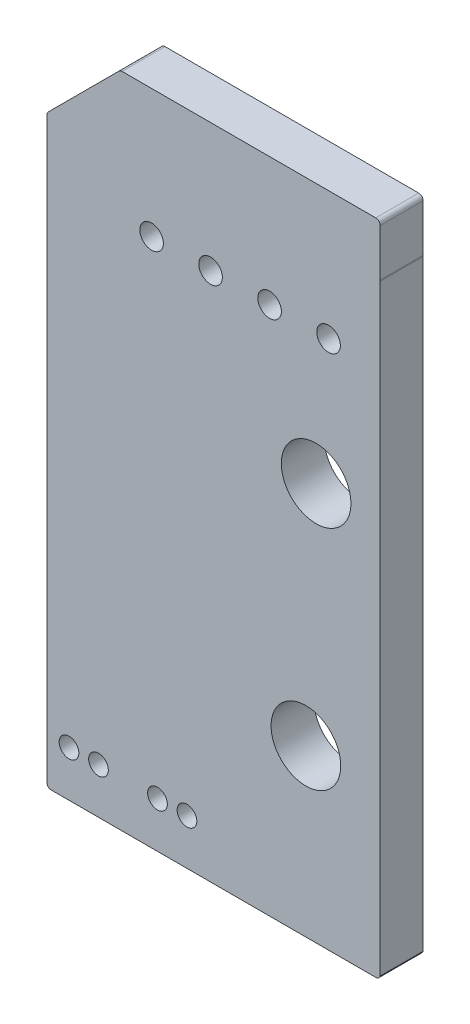
ISO-10303-21;
HEADER;
FILE_DESCRIPTION(('STEP AP214'),'2;1');
FILE_NAME('part.step','',(''),(''),'','','');
FILE_SCHEMA(('AUTOMOTIVE_DESIGN { 1 0 10303 214 1 1 1 1 }'));
ENDSEC;
DATA;
#1=APPLICATION_CONTEXT('core data for automotive mechanical design processes');
#2=APPLICATION_PROTOCOL_DEFINITION('international standard','automotive_design',2000,#1);
#3=PRODUCT_CONTEXT('',#1,'mechanical');
#4=PRODUCT('Part','Part','',(#3));
#5=PRODUCT_RELATED_PRODUCT_CATEGORY('part','',(#4));
#6=PRODUCT_DEFINITION_FORMATION('','',#4);
#7=PRODUCT_DEFINITION_CONTEXT('part definition',#1,'design');
#8=PRODUCT_DEFINITION('design','',#6,#7);
#9=PRODUCT_DEFINITION_SHAPE('','',#8);
#10=(LENGTH_UNIT() NAMED_UNIT(*) SI_UNIT(.MILLI.,.METRE.));
#11=(NAMED_UNIT(*) PLANE_ANGLE_UNIT() SI_UNIT($,.RADIAN.));
#12=(NAMED_UNIT(*) SI_UNIT($,.STERADIAN.) SOLID_ANGLE_UNIT());
#13=UNCERTAINTY_MEASURE_WITH_UNIT(LENGTH_MEASURE(1.E-05),#10,'distance_accuracy_value','');
#14=(GEOMETRIC_REPRESENTATION_CONTEXT(3) GLOBAL_UNCERTAINTY_ASSIGNED_CONTEXT((#13)) GLOBAL_UNIT_ASSIGNED_CONTEXT((#10,
#11,#12)) REPRESENTATION_CONTEXT('',''));
#15=CARTESIAN_POINT('',(0.,0.,0.));
#16=DIRECTION('',(0.,0.,1.));
#17=DIRECTION('',(1.,0.,0.));
#18=AXIS2_PLACEMENT_3D('',#15,#16,#17);
#19=CARTESIAN_POINT('',(7.16790000000064,0.,1.85));
#20=DIRECTION('',(-1.,0.,0.));
#21=DIRECTION('',(0.,0.,1.));
#22=AXIS2_PLACEMENT_3D('',#19,#20,#21);
#23=PLANE('',#22);
#24=DIRECTION('',(0.,1.,0.));
#25=VECTOR('',#24,1.);
#26=CARTESIAN_POINT('',(7.16790000000064,0.,0.));
#27=LINE('',#26,#25);
#28=CARTESIAN_POINT('',(7.16790000000064,-13.994089221172,0.));
#29=VERTEX_POINT('',#28);
#30=CARTESIAN_POINT('',(7.16790000000064,11.9139286193169,0.));
#31=VERTEX_POINT('',#30);
#32=EDGE_CURVE('E186',#29,#31,#27,.T.);
#33=ORIENTED_EDGE('',*,*,#32,.T.);
#34=DIRECTION('',(0.,0.,-1.));
#35=VECTOR('',#34,1.);
#36=CARTESIAN_POINT('',(7.16790000000064,11.9139286193169,1.85));
#37=LINE('',#36,#35);
#38=CARTESIAN_POINT('',(7.16790000000064,11.9139286193169,1.85));
#39=VERTEX_POINT('',#38);
#40=EDGE_CURVE('E11',#39,#31,#37,.T.);
#41=ORIENTED_EDGE('',*,*,#40,.F.);
#42=DIRECTION('',(0.,1.,0.));
#43=VECTOR('',#42,1.);
#44=CARTESIAN_POINT('',(7.16790000000064,0.,1.85));
#45=LINE('',#44,#43);
#46=CARTESIAN_POINT('',(7.16790000000064,-13.994089221172,1.85));
#47=VERTEX_POINT('',#46);
#48=EDGE_CURVE('E270',#47,#39,#45,.T.);
#49=ORIENTED_EDGE('',*,*,#48,.F.);
#50=DIRECTION('',(0.,0.,-1.));
#51=VECTOR('',#50,1.);
#52=CARTESIAN_POINT('',(7.16790000000064,-13.994089221172,1.85));
#53=LINE('',#52,#51);
#54=EDGE_CURVE('E152',#47,#29,#53,.T.);
#55=ORIENTED_EDGE('',*,*,#54,.T.);
#56=EDGE_LOOP('',(#33,#41,#49,#55));
#57=FACE_BOUND('',#56,.T.);
#58=ADVANCED_FACE('F36',(#57),#23,.F.);
#59=CARTESIAN_POINT('',(6.98500000000043,11.9672000000003,1.85));
#60=DIRECTION('',(0.,0.,-1.));
#61=DIRECTION('',(-1.,0.,0.));
#62=AXIS2_PLACEMENT_3D('',#59,#60,#61);
#63=CYLINDRICAL_SURFACE('',#62,0.190499999999983);
#64=CARTESIAN_POINT('',(6.98500000000043,11.9672000000003,0.));
#65=DIRECTION('',(0.,0.,1.));
#66=DIRECTION('',(1.,0.,0.));
#67=AXIS2_PLACEMENT_3D('',#64,#65,#66);
#68=CIRCLE('',#67,0.190499999999983);
#69=CARTESIAN_POINT('',(7.17550000000041,11.9672000000003,0.));
#70=VERTEX_POINT('',#69);
#71=EDGE_CURVE('E189',#31,#70,#68,.T.);
#72=ORIENTED_EDGE('',*,*,#71,.T.);
#73=DIRECTION('',(0.,0.,-1.));
#74=VECTOR('',#73,1.);
#75=CARTESIAN_POINT('',(7.17550000000041,11.9672000000003,1.85));
#76=LINE('',#75,#74);
#77=CARTESIAN_POINT('',(7.17550000000041,11.9672000000003,1.85));
#78=VERTEX_POINT('',#77);
#79=EDGE_CURVE('E45',#78,#70,#76,.T.);
#80=ORIENTED_EDGE('',*,*,#79,.F.);
#81=CARTESIAN_POINT('',(6.98500000000043,11.9672000000003,1.85));
#82=DIRECTION('',(0.,0.,1.));
#83=DIRECTION('',(1.,0.,0.));
#84=AXIS2_PLACEMENT_3D('',#81,#82,#83);
#85=CIRCLE('',#84,0.190499999999983);
#86=EDGE_CURVE('E108',#39,#78,#85,.T.);
#87=ORIENTED_EDGE('',*,*,#86,.F.);
#88=ORIENTED_EDGE('',*,*,#40,.T.);
#89=EDGE_LOOP('',(#72,#80,#87,#88));
#90=FACE_BOUND('',#89,.T.);
#91=ADVANCED_FACE('F285',(#90),#63,.T.);
#92=CARTESIAN_POINT('',(7.17550000000041,0.,1.85));
#93=DIRECTION('',(-1.,0.,0.));
#94=DIRECTION('',(0.,0.,1.));
#95=AXIS2_PLACEMENT_3D('',#92,#93,#94);
#96=PLANE('',#95);
#97=DIRECTION('',(0.,1.,0.));
#98=VECTOR('',#97,1.);
#99=CARTESIAN_POINT('',(7.17550000000041,0.,0.));
#100=LINE('',#99,#98);
#101=CARTESIAN_POINT('',(7.17550000000041,13.9992000000003,0.));
#102=VERTEX_POINT('',#101);
#103=EDGE_CURVE('E191',#70,#102,#100,.T.);
#104=ORIENTED_EDGE('',*,*,#103,.T.);
#105=DIRECTION('',(0.,0.,-1.));
#106=VECTOR('',#105,1.);
#107=CARTESIAN_POINT('',(7.17550000000041,13.9992000000003,1.85));
#108=LINE('',#107,#106);
#109=CARTESIAN_POINT('',(7.17550000000041,13.9992000000003,1.85));
#110=VERTEX_POINT('',#109);
#111=EDGE_CURVE('E228',#110,#102,#108,.T.);
#112=ORIENTED_EDGE('',*,*,#111,.F.);
#113=DIRECTION('',(0.,1.,0.));
#114=VECTOR('',#113,1.);
#115=CARTESIAN_POINT('',(7.17550000000041,0.,1.85));
#116=LINE('',#115,#114);
#117=EDGE_CURVE('E236',#78,#110,#116,.T.);
#118=ORIENTED_EDGE('',*,*,#117,.F.);
#119=ORIENTED_EDGE('',*,*,#79,.T.);
#120=EDGE_LOOP('',(#104,#112,#118,#119));
#121=FACE_BOUND('',#120,.T.);
#122=ADVANCED_FACE('F234',(#121),#96,.F.);
#123=CARTESIAN_POINT('',(6.98500231875086,13.9991976812545,1.85));
#124=DIRECTION('',(0.,0.,-1.));
#125=DIRECTION('',(-1.,0.,0.));
#126=AXIS2_PLACEMENT_3D('',#123,#124,#125);
#127=CYLINDRICAL_SURFACE('',#126,0.190497681263717);
#128=CARTESIAN_POINT('',(6.98500231875086,13.9991976812545,0.));
#129=DIRECTION('',(0.,0.,1.));
#130=DIRECTION('',(1.,0.,0.));
#131=AXIS2_PLACEMENT_3D('',#128,#129,#130);
#132=CIRCLE('',#131,0.190497681263717);
#133=CARTESIAN_POINT('',(6.98500192090921,14.1896953625179,0.));
#134=VERTEX_POINT('',#133);
#135=EDGE_CURVE('E193',#102,#134,#132,.T.);
#136=ORIENTED_EDGE('',*,*,#135,.T.);
#137=DIRECTION('',(0.,0.,-1.));
#138=VECTOR('',#137,1.);
#139=CARTESIAN_POINT('',(6.98500192090921,14.1896953625179,1.85));
#140=LINE('',#139,#138);
#141=CARTESIAN_POINT('',(6.98500192090921,14.1896953625179,1.85));
#142=VERTEX_POINT('',#141);
#143=EDGE_CURVE('E226',#142,#134,#140,.T.);
#144=ORIENTED_EDGE('',*,*,#143,.F.);
#145=CARTESIAN_POINT('',(6.98500231875086,13.9991976812545,1.85));
#146=DIRECTION('',(0.,0.,1.));
#147=DIRECTION('',(1.,0.,0.));
#148=AXIS2_PLACEMENT_3D('',#145,#146,#147);
#149=CIRCLE('',#148,0.190497681263717);
#150=EDGE_CURVE('E248',#110,#142,#149,.T.);
#151=ORIENTED_EDGE('',*,*,#150,.F.);
#152=ORIENTED_EDGE('',*,*,#111,.T.);
#153=EDGE_LOOP('',(#136,#144,#151,#152));
#154=FACE_BOUND('',#153,.T.);
#155=ADVANCED_FACE('F245',(#154),#127,.T.);
#156=CARTESIAN_POINT('',(0.,14.1896953625179,1.85));
#157=DIRECTION('',(0.,1.,0.));
#158=DIRECTION('',(0.,0.,1.));
#159=AXIS2_PLACEMENT_3D('',#156,#157,#158);
#160=PLANE('',#159);
#161=DIRECTION('',(1.,0.,0.));
#162=VECTOR('',#161,1.);
#163=CARTESIAN_POINT('',(0.,14.1896953625179,0.));
#164=LINE('',#163,#162);
#165=CARTESIAN_POINT('',(-3.93699807909067,14.1896953625179,0.));
#166=VERTEX_POINT('',#165);
#167=EDGE_CURVE('E196',#166,#134,#164,.T.);
#168=ORIENTED_EDGE('',*,*,#167,.F.);
#169=DIRECTION('',(0.,0.,-1.));
#170=VECTOR('',#169,1.);
#171=CARTESIAN_POINT('',(-3.93699807909067,14.1896953625179,1.85));
#172=LINE('',#171,#170);
#173=CARTESIAN_POINT('',(-3.93699807909067,14.1896953625179,1.85));
#174=VERTEX_POINT('',#173);
#175=EDGE_CURVE('E224',#174,#166,#172,.T.);
#176=ORIENTED_EDGE('',*,*,#175,.F.);
#177=DIRECTION('',(1.,0.,0.));
#178=VECTOR('',#177,1.);
#179=CARTESIAN_POINT('',(0.,14.1896953625179,1.85));
#180=LINE('',#179,#178);
#181=EDGE_CURVE('E250',#174,#142,#180,.T.);
#182=ORIENTED_EDGE('',*,*,#181,.T.);
#183=ORIENTED_EDGE('',*,*,#143,.T.);
#184=EDGE_LOOP('',(#168,#176,#182,#183));
#185=FACE_BOUND('',#184,.T.);
#186=ADVANCED_FACE('F485',(#185),#160,.T.);
#187=CARTESIAN_POINT('',(-3.93699807909173,13.9991980790919,1.85));
#188=DIRECTION('',(0.,0.,-1.));
#189=DIRECTION('',(-1.,0.,0.));
#190=AXIS2_PLACEMENT_3D('',#187,#188,#189);
#191=CYLINDRICAL_SURFACE('',#190,0.190497283425992);
#192=CARTESIAN_POINT('',(-3.93699807909173,13.9991980790919,0.));
#193=DIRECTION('',(0.,0.,1.));
#194=DIRECTION('',(1.,0.,0.));
#195=AXIS2_PLACEMENT_3D('',#192,#193,#194);
#196=CIRCLE('',#195,0.190497283425992);
#197=CARTESIAN_POINT('',(-4.0716999999999,14.1338999999999,0.));
#198=VERTEX_POINT('',#197);
#199=EDGE_CURVE('E199',#166,#198,#196,.T.);
#200=ORIENTED_EDGE('',*,*,#199,.T.);
#201=DIRECTION('',(0.,0.,-1.));
#202=VECTOR('',#201,1.);
#203=CARTESIAN_POINT('',(-4.0716999999999,14.1338999999999,1.85));
#204=LINE('',#203,#202);
#205=CARTESIAN_POINT('',(-4.0716999999999,14.1338999999999,1.85));
#206=VERTEX_POINT('',#205);
#207=EDGE_CURVE('E222',#206,#198,#204,.T.);
#208=ORIENTED_EDGE('',*,*,#207,.F.);
#209=CARTESIAN_POINT('',(-3.93699807909173,13.9991980790919,1.85));
#210=DIRECTION('',(0.,0.,1.));
#211=DIRECTION('',(1.,0.,0.));
#212=AXIS2_PLACEMENT_3D('',#209,#210,#211);
#213=CIRCLE('',#212,0.190497283425992);
#214=EDGE_CURVE('E252',#174,#206,#213,.T.);
#215=ORIENTED_EDGE('',*,*,#214,.F.);
#216=ORIENTED_EDGE('',*,*,#175,.T.);
#217=EDGE_LOOP('',(#200,#208,#215,#216));
#218=FACE_BOUND('',#217,.T.);
#219=ADVANCED_FACE('F475',(#218),#191,.T.);
#220=CARTESIAN_POINT('',(-9.10279999999991,9.10279999999991,1.85));
#221=DIRECTION('',(-0.707106781186548,0.707106781186548,0.));
#222=DIRECTION('',(-0.707106781186548,-0.707106781186548,0.));
#223=AXIS2_PLACEMENT_3D('',#220,#221,#222);
#224=PLANE('',#223);
#225=DIRECTION('',(0.707106781186548,0.707106781186548,0.));
#226=VECTOR('',#225,1.);
#227=CARTESIAN_POINT('',(-9.10279999999991,9.10279999999991,0.));
#228=LINE('',#227,#226);
#229=CARTESIAN_POINT('',(-7.11969999999984,11.0859,0.));
#230=VERTEX_POINT('',#229);
#231=EDGE_CURVE('E202',#230,#198,#228,.T.);
#232=ORIENTED_EDGE('',*,*,#231,.F.);
#233=DIRECTION('',(0.,0.,-1.));
#234=VECTOR('',#233,1.);
#235=CARTESIAN_POINT('',(-7.11969999999984,11.0859,1.85));
#236=LINE('',#235,#234);
#237=CARTESIAN_POINT('',(-7.11969999999984,11.0859,1.85));
#238=VERTEX_POINT('',#237);
#239=EDGE_CURVE('E220',#238,#230,#236,.T.);
#240=ORIENTED_EDGE('',*,*,#239,.F.);
#241=DIRECTION('',(0.707106781186548,0.707106781186548,0.));
#242=VECTOR('',#241,1.);
#243=CARTESIAN_POINT('',(-9.10279999999991,9.10279999999991,1.85));
#244=LINE('',#243,#242);
#245=EDGE_CURVE('E258',#238,#206,#244,.T.);
#246=ORIENTED_EDGE('',*,*,#245,.T.);
#247=ORIENTED_EDGE('',*,*,#207,.T.);
#248=EDGE_LOOP('',(#232,#240,#246,#247));
#249=FACE_BOUND('',#248,.T.);
#250=ADVANCED_FACE('F464',(#249),#224,.T.);
#251=CARTESIAN_POINT('',(-6.9849980790917,10.9511980790918,1.85));
#252=DIRECTION('',(0.,0.,-1.));
#253=DIRECTION('',(-1.,0.,0.));
#254=AXIS2_PLACEMENT_3D('',#251,#252,#253);
#255=CYLINDRICAL_SURFACE('',#254,0.190497283425928);
#256=CARTESIAN_POINT('',(-6.9849980790917,10.9511980790918,0.));
#257=DIRECTION('',(0.,0.,1.));
#258=DIRECTION('',(1.,0.,0.));
#259=AXIS2_PLACEMENT_3D('',#256,#257,#258);
#260=CIRCLE('',#259,0.190497283425928);
#261=CARTESIAN_POINT('',(-7.17549536251754,10.9511980790918,0.));
#262=VERTEX_POINT('',#261);
#263=EDGE_CURVE('E205',#230,#262,#260,.T.);
#264=ORIENTED_EDGE('',*,*,#263,.T.);
#265=DIRECTION('',(0.,0.,-1.));
#266=VECTOR('',#265,1.);
#267=CARTESIAN_POINT('',(-7.17549536251754,10.9511980790918,1.85));
#268=LINE('',#267,#266);
#269=CARTESIAN_POINT('',(-7.17549536251754,10.9511980790918,1.85));
#270=VERTEX_POINT('',#269);
#271=EDGE_CURVE('E218',#270,#262,#268,.T.);
#272=ORIENTED_EDGE('',*,*,#271,.F.);
#273=CARTESIAN_POINT('',(-6.9849980790917,10.9511980790918,1.85));
#274=DIRECTION('',(0.,0.,1.));
#275=DIRECTION('',(1.,0.,0.));
#276=AXIS2_PLACEMENT_3D('',#273,#274,#275);
#277=CIRCLE('',#276,0.190497283425928);
#278=EDGE_CURVE('E261',#238,#270,#277,.T.);
#279=ORIENTED_EDGE('',*,*,#278,.F.);
#280=ORIENTED_EDGE('',*,*,#239,.T.);
#281=EDGE_LOOP('',(#264,#272,#279,#280));
#282=FACE_BOUND('',#281,.T.);
#283=ADVANCED_FACE('F455',(#282),#255,.T.);
#284=CARTESIAN_POINT('',(-7.17549536251754,0.,1.85));
#285=DIRECTION('',(-1.,0.,0.));
#286=DIRECTION('',(0.,0.,1.));
#287=AXIS2_PLACEMENT_3D('',#284,#285,#286);
#288=PLANE('',#287);
#289=DIRECTION('',(0.,1.,0.));
#290=VECTOR('',#289,1.);
#291=CARTESIAN_POINT('',(-7.17549536251754,0.,0.));
#292=LINE('',#291,#290);
#293=CARTESIAN_POINT('',(-7.17549536251754,-13.9408019209082,0.));
#294=VERTEX_POINT('',#293);
#295=EDGE_CURVE('E208',#294,#262,#292,.T.);
#296=ORIENTED_EDGE('',*,*,#295,.F.);
#297=DIRECTION('',(0.,0.,-1.));
#298=VECTOR('',#297,1.);
#299=CARTESIAN_POINT('',(-7.17549536251754,-13.9408019209082,1.85));
#300=LINE('',#299,#298);
#301=CARTESIAN_POINT('',(-7.17549536251754,-13.9408019209082,1.85));
#302=VERTEX_POINT('',#301);
#303=EDGE_CURVE('E147',#302,#294,#300,.T.);
#304=ORIENTED_EDGE('',*,*,#303,.F.);
#305=DIRECTION('',(0.,1.,0.));
#306=VECTOR('',#305,1.);
#307=CARTESIAN_POINT('',(-7.17549536251754,0.,1.85));
#308=LINE('',#307,#306);
#309=EDGE_CURVE('E140',#302,#270,#308,.T.);
#310=ORIENTED_EDGE('',*,*,#309,.T.);
#311=ORIENTED_EDGE('',*,*,#271,.T.);
#312=EDGE_LOOP('',(#296,#304,#310,#311));
#313=FACE_BOUND('',#312,.T.);
#314=ADVANCED_FACE('F264',(#313),#288,.T.);
#315=CARTESIAN_POINT('',(-6.98499536251756,-13.9408019209082,1.85));
#316=DIRECTION('',(0.,0.,-1.));
#317=DIRECTION('',(-1.,0.,0.));
#318=AXIS2_PLACEMENT_3D('',#315,#316,#317);
#319=CYLINDRICAL_SURFACE('',#318,0.190499999999996);
#320=CARTESIAN_POINT('',(-6.98499536251756,-13.9408019209082,0.));
#321=DIRECTION('',(0.,0.,1.));
#322=DIRECTION('',(1.,0.,0.));
#323=AXIS2_PLACEMENT_3D('',#320,#321,#322);
#324=CIRCLE('',#323,0.190499999999996);
#325=CARTESIAN_POINT('',(-6.98499536251723,-14.1313019209082,0.));
#326=VERTEX_POINT('',#325);
#327=EDGE_CURVE('E146',#294,#326,#324,.T.);
#328=ORIENTED_EDGE('',*,*,#327,.T.);
#329=DIRECTION('',(0.,0.,-1.));
#330=VECTOR('',#329,1.);
#331=CARTESIAN_POINT('',(-6.98499536251723,-14.1313019209082,1.85));
#332=LINE('',#331,#330);
#333=CARTESIAN_POINT('',(-6.98499536251723,-14.1313019209082,1.85));
#334=VERTEX_POINT('',#333);
#335=EDGE_CURVE('E143',#334,#326,#332,.T.);
#336=ORIENTED_EDGE('',*,*,#335,.F.);
#337=CARTESIAN_POINT('',(-6.98499536251756,-13.9408019209082,1.85));
#338=DIRECTION('',(0.,0.,1.));
#339=DIRECTION('',(1.,0.,0.));
#340=AXIS2_PLACEMENT_3D('',#337,#338,#339);
#341=CIRCLE('',#340,0.190499999999996);
#342=EDGE_CURVE('E134',#302,#334,#341,.T.);
#343=ORIENTED_EDGE('',*,*,#342,.F.);
#344=ORIENTED_EDGE('',*,*,#303,.T.);
#345=EDGE_LOOP('',(#328,#336,#343,#344));
#346=FACE_BOUND('',#345,.T.);
#347=ADVANCED_FACE('F144',(#346),#319,.T.);
#348=CARTESIAN_POINT('',(0.,-14.1313019209082,1.85));
#349=DIRECTION('',(0.,1.,0.));
#350=DIRECTION('',(0.,0.,1.));
#351=AXIS2_PLACEMENT_3D('',#348,#349,#350);
#352=PLANE('',#351);
#353=DIRECTION('',(1.,0.,0.));
#354=VECTOR('',#353,1.);
#355=CARTESIAN_POINT('',(0.,-14.1313019209082,0.));
#356=LINE('',#355,#354);
#357=CARTESIAN_POINT('',(6.98500463748259,-14.1313019209082,0.));
#358=VERTEX_POINT('',#357);
#359=EDGE_CURVE('E94',#326,#358,#356,.T.);
#360=ORIENTED_EDGE('',*,*,#359,.T.);
#361=DIRECTION('',(0.,0.,-1.));
#362=VECTOR('',#361,1.);
#363=CARTESIAN_POINT('',(6.98500463748259,-14.1313019209082,1.85));
#364=LINE('',#363,#362);
#365=CARTESIAN_POINT('',(6.98500463748259,-14.1313019209082,1.85));
#366=VERTEX_POINT('',#365);
#367=EDGE_CURVE('E148',#366,#358,#364,.T.);
#368=ORIENTED_EDGE('',*,*,#367,.F.);
#369=DIRECTION('',(1.,0.,0.));
#370=VECTOR('',#369,1.);
#371=CARTESIAN_POINT('',(0.,-14.1313019209082,1.85));
#372=LINE('',#371,#370);
#373=EDGE_CURVE('E138',#334,#366,#372,.T.);
#374=ORIENTED_EDGE('',*,*,#373,.F.);
#375=ORIENTED_EDGE('',*,*,#335,.T.);
#376=EDGE_LOOP('',(#360,#368,#374,#375));
#377=FACE_BOUND('',#376,.T.);
#378=ADVANCED_FACE('F150',(#377),#352,.F.);
#379=CARTESIAN_POINT('',(-2.66699999999997,8.66519999999998,1.85));
#380=DIRECTION('',(0.,0.,-1.));
#381=DIRECTION('',(-1.,0.,0.));
#382=AXIS2_PLACEMENT_3D('',#379,#380,#381);
#383=CYLINDRICAL_SURFACE('',#382,0.508000000000008);
#384=CARTESIAN_POINT('',(-2.66699999999997,8.66519999999998,1.85));
#385=DIRECTION('',(0.,0.,1.));
#386=DIRECTION('',(1.,0.,0.));
#387=AXIS2_PLACEMENT_3D('',#384,#385,#386);
#388=CIRCLE('',#387,0.508000000000008);
#389=CARTESIAN_POINT('',(-2.15899999999997,8.66519999999998,1.85));
#390=VERTEX_POINT('',#389);
#391=EDGE_CURVE('E567',#390,#390,#388,.T.);
#392=ORIENTED_EDGE('',*,*,#391,.T.);
#393=EDGE_LOOP('',(#392));
#394=FACE_BOUND('',#393,.T.);
#395=CARTESIAN_POINT('',(-2.66699999999997,8.66519999999998,0.));
#396=DIRECTION('',(0.,0.,1.));
#397=DIRECTION('',(1.,0.,0.));
#398=AXIS2_PLACEMENT_3D('',#395,#396,#397);
#399=CIRCLE('',#398,0.508000000000008);
#400=CARTESIAN_POINT('',(-2.15899999999997,8.66519999999998,0.));
#401=VERTEX_POINT('',#400);
#402=EDGE_CURVE('E183',#401,#401,#399,.T.);
#403=ORIENTED_EDGE('',*,*,#402,.F.);
#404=EDGE_LOOP('',(#403));
#405=FACE_BOUND('',#404,.T.);
#406=ADVANCED_FACE('F293',(#394,#405),#383,.F.);
#407=CARTESIAN_POINT('',(-0.126999999999988,8.66519999999998,1.85));
#408=DIRECTION('',(0.,0.,-1.));
#409=DIRECTION('',(-1.,0.,0.));
#410=AXIS2_PLACEMENT_3D('',#407,#408,#409);
#411=CYLINDRICAL_SURFACE('',#410,0.508000000000009);
#412=CARTESIAN_POINT('',(-0.126999999999988,8.66519999999998,1.85));
#413=DIRECTION('',(0.,0.,1.));
#414=DIRECTION('',(1.,0.,0.));
#415=AXIS2_PLACEMENT_3D('',#412,#413,#414);
#416=CIRCLE('',#415,0.508000000000009);
#417=CARTESIAN_POINT('',(0.38100000000002,8.66519999999998,1.85));
#418=VERTEX_POINT('',#417);
#419=EDGE_CURVE('E564',#418,#418,#416,.T.);
#420=ORIENTED_EDGE('',*,*,#419,.T.);
#421=EDGE_LOOP('',(#420));
#422=FACE_BOUND('',#421,.T.);
#423=CARTESIAN_POINT('',(-0.126999999999988,8.66519999999998,0.));
#424=DIRECTION('',(0.,0.,1.));
#425=DIRECTION('',(1.,0.,0.));
#426=AXIS2_PLACEMENT_3D('',#423,#424,#425);
#427=CIRCLE('',#426,0.508000000000009);
#428=CARTESIAN_POINT('',(0.38100000000002,8.66519999999998,0.));
#429=VERTEX_POINT('',#428);
#430=EDGE_CURVE('E180',#429,#429,#427,.T.);
#431=ORIENTED_EDGE('',*,*,#430,.F.);
#432=EDGE_LOOP('',(#431));
#433=FACE_BOUND('',#432,.T.);
#434=ADVANCED_FACE('F296',(#422,#433),#411,.F.);
#435=CARTESIAN_POINT('',(4.41697954933071,3.00099999999998,1.85));
#436=DIRECTION('',(0.,0.,-1.));
#437=DIRECTION('',(-1.,0.,0.));
#438=AXIS2_PLACEMENT_3D('',#435,#436,#437);
#439=CYLINDRICAL_SURFACE('',#438,1.4998795493306);
#440=CARTESIAN_POINT('',(4.41697954933071,3.00099999999998,1.85));
#441=DIRECTION('',(0.,0.,1.));
#442=DIRECTION('',(1.,0.,0.));
#443=AXIS2_PLACEMENT_3D('',#440,#441,#442);
#444=CIRCLE('',#443,1.4998795493306);
#445=CARTESIAN_POINT('',(5.91685909866131,3.00099999999998,1.85));
#446=VERTEX_POINT('',#445);
#447=EDGE_CURVE('E561',#446,#446,#444,.T.);
#448=ORIENTED_EDGE('',*,*,#447,.T.);
#449=EDGE_LOOP('',(#448));
#450=FACE_BOUND('',#449,.T.);
#451=CARTESIAN_POINT('',(4.41697954933071,3.00099999999998,0.));
#452=DIRECTION('',(0.,0.,1.));
#453=DIRECTION('',(1.,0.,0.));
#454=AXIS2_PLACEMENT_3D('',#451,#452,#453);
#455=CIRCLE('',#454,1.4998795493306);
#456=CARTESIAN_POINT('',(5.91685909866131,3.00099999999998,0.));
#457=VERTEX_POINT('',#456);
#458=EDGE_CURVE('E177',#457,#457,#455,.T.);
#459=ORIENTED_EDGE('',*,*,#458,.F.);
#460=EDGE_LOOP('',(#459));
#461=FACE_BOUND('',#460,.T.);
#462=ADVANCED_FACE('F300',(#450,#461),#439,.F.);
#463=CARTESIAN_POINT('',(3.97765000000017,-6.99900000000003,1.85));
#464=DIRECTION('',(0.,0.,-1.));
#465=DIRECTION('',(-1.,0.,0.));
#466=AXIS2_PLACEMENT_3D('',#463,#464,#465);
#467=CYLINDRICAL_SURFACE('',#466,1.4998795493306);
#468=CARTESIAN_POINT('',(3.97765000000017,-6.99900000000003,1.85));
#469=DIRECTION('',(0.,0.,1.));
#470=DIRECTION('',(1.,0.,0.));
#471=AXIS2_PLACEMENT_3D('',#468,#469,#470);
#472=CIRCLE('',#471,1.4998795493306);
#473=CARTESIAN_POINT('',(5.47752954933076,-6.99900000000003,1.85));
#474=VERTEX_POINT('',#473);
#475=EDGE_CURVE('E558',#474,#474,#472,.T.);
#476=ORIENTED_EDGE('',*,*,#475,.T.);
#477=EDGE_LOOP('',(#476));
#478=FACE_BOUND('',#477,.T.);
#479=CARTESIAN_POINT('',(3.97765000000017,-6.99900000000003,0.));
#480=DIRECTION('',(0.,0.,1.));
#481=DIRECTION('',(1.,0.,0.));
#482=AXIS2_PLACEMENT_3D('',#479,#480,#481);
#483=CIRCLE('',#482,1.4998795493306);
#484=CARTESIAN_POINT('',(5.47752954933076,-6.99900000000003,0.));
#485=VERTEX_POINT('',#484);
#486=EDGE_CURVE('E174',#485,#485,#483,.T.);
#487=ORIENTED_EDGE('',*,*,#486,.F.);
#488=EDGE_LOOP('',(#487));
#489=FACE_BOUND('',#488,.T.);
#490=ADVANCED_FACE('F304',(#478,#489),#467,.F.);
#491=CARTESIAN_POINT('',(2.41300000000022,8.66519999999998,1.85));
#492=DIRECTION('',(0.,0.,-1.));
#493=DIRECTION('',(-1.,0.,0.));
#494=AXIS2_PLACEMENT_3D('',#491,#492,#493);
#495=CYLINDRICAL_SURFACE('',#494,0.508000000000008);
#496=CARTESIAN_POINT('',(2.41300000000022,8.66519999999998,1.85));
#497=DIRECTION('',(0.,0.,1.));
#498=DIRECTION('',(1.,0.,0.));
#499=AXIS2_PLACEMENT_3D('',#496,#497,#498);
#500=CIRCLE('',#499,0.508000000000008);
#501=CARTESIAN_POINT('',(2.92100000000023,8.66519999999998,1.85));
#502=VERTEX_POINT('',#501);
#503=EDGE_CURVE('E555',#502,#502,#500,.T.);
#504=ORIENTED_EDGE('',*,*,#503,.T.);
#505=EDGE_LOOP('',(#504));
#506=FACE_BOUND('',#505,.T.);
#507=CARTESIAN_POINT('',(2.41300000000022,8.66519999999998,0.));
#508=DIRECTION('',(0.,0.,1.));
#509=DIRECTION('',(1.,0.,0.));
#510=AXIS2_PLACEMENT_3D('',#507,#508,#509);
#511=CIRCLE('',#510,0.508000000000008);
#512=CARTESIAN_POINT('',(2.92100000000023,8.66519999999998,0.));
#513=VERTEX_POINT('',#512);
#514=EDGE_CURVE('E171',#513,#513,#511,.T.);
#515=ORIENTED_EDGE('',*,*,#514,.F.);
#516=EDGE_LOOP('',(#515));
#517=FACE_BOUND('',#516,.T.);
#518=ADVANCED_FACE('F308',(#506,#517),#495,.F.);
#519=CARTESIAN_POINT('',(4.95300000000021,8.66519999999998,1.85));
#520=DIRECTION('',(0.,0.,-1.));
#521=DIRECTION('',(-1.,0.,0.));
#522=AXIS2_PLACEMENT_3D('',#519,#520,#521);
#523=CYLINDRICAL_SURFACE('',#522,0.508000000000008);
#524=CARTESIAN_POINT('',(4.95300000000021,8.66519999999998,1.85));
#525=DIRECTION('',(0.,0.,1.));
#526=DIRECTION('',(1.,0.,0.));
#527=AXIS2_PLACEMENT_3D('',#524,#525,#526);
#528=CIRCLE('',#527,0.508000000000008);
#529=CARTESIAN_POINT('',(5.46100000000022,8.66519999999998,1.85));
#530=VERTEX_POINT('',#529);
#531=EDGE_CURVE('E552',#530,#530,#528,.T.);
#532=ORIENTED_EDGE('',*,*,#531,.T.);
#533=EDGE_LOOP('',(#532));
#534=FACE_BOUND('',#533,.T.);
#535=CARTESIAN_POINT('',(4.95300000000021,8.66519999999998,0.));
#536=DIRECTION('',(0.,0.,1.));
#537=DIRECTION('',(1.,0.,0.));
#538=AXIS2_PLACEMENT_3D('',#535,#536,#537);
#539=CIRCLE('',#538,0.508000000000008);
#540=CARTESIAN_POINT('',(5.46100000000022,8.66519999999998,0.));
#541=VERTEX_POINT('',#540);
#542=EDGE_CURVE('E168',#541,#541,#539,.T.);
#543=ORIENTED_EDGE('',*,*,#542,.F.);
#544=EDGE_LOOP('',(#543));
#545=FACE_BOUND('',#544,.T.);
#546=ADVANCED_FACE('F312',(#534,#545),#523,.F.);
#547=CARTESIAN_POINT('',(-6.22299999999987,-12.1628,1.85));
#548=DIRECTION('',(0.,0.,-1.));
#549=DIRECTION('',(-1.,0.,0.));
#550=AXIS2_PLACEMENT_3D('',#547,#548,#549);
#551=CYLINDRICAL_SURFACE('',#550,0.423839804643236);
#552=CARTESIAN_POINT('',(-6.22299999999987,-12.1628,1.85));
#553=DIRECTION('',(0.,0.,1.));
#554=DIRECTION('',(1.,0.,0.));
#555=AXIS2_PLACEMENT_3D('',#552,#553,#554);
#556=CIRCLE('',#555,0.423839804643236);
#557=CARTESIAN_POINT('',(-5.79916019535663,-12.1628,1.85));
#558=VERTEX_POINT('',#557);
#559=EDGE_CURVE('E545',#558,#558,#556,.T.);
#560=ORIENTED_EDGE('',*,*,#559,.T.);
#561=EDGE_LOOP('',(#560));
#562=FACE_BOUND('',#561,.T.);
#563=CARTESIAN_POINT('',(-6.22299999999987,-12.1628,0.));
#564=DIRECTION('',(0.,0.,1.));
#565=DIRECTION('',(1.,0.,0.));
#566=AXIS2_PLACEMENT_3D('',#563,#564,#565);
#567=CIRCLE('',#566,0.423839804643236);
#568=CARTESIAN_POINT('',(-5.79916019535663,-12.1628,0.));
#569=VERTEX_POINT('',#568);
#570=EDGE_CURVE('E165',#569,#569,#567,.T.);
#571=ORIENTED_EDGE('',*,*,#570,.F.);
#572=EDGE_LOOP('',(#571));
#573=FACE_BOUND('',#572,.T.);
#574=ADVANCED_FACE('F316',(#562,#573),#551,.F.);
#575=CARTESIAN_POINT('',(-4.95299999999982,-12.1628,1.85));
#576=DIRECTION('',(0.,0.,-1.));
#577=DIRECTION('',(-1.,0.,0.));
#578=AXIS2_PLACEMENT_3D('',#575,#576,#577);
#579=CYLINDRICAL_SURFACE('',#578,0.423839804643158);
#580=CARTESIAN_POINT('',(-4.95299999999982,-12.1628,1.85));
#581=DIRECTION('',(0.,0.,1.));
#582=DIRECTION('',(1.,0.,0.));
#583=AXIS2_PLACEMENT_3D('',#580,#581,#582);
#584=CIRCLE('',#583,0.423839804643158);
#585=CARTESIAN_POINT('',(-4.52916019535666,-12.1628,1.85));
#586=VERTEX_POINT('',#585);
#587=EDGE_CURVE('E542',#586,#586,#584,.T.);
#588=ORIENTED_EDGE('',*,*,#587,.T.);
#589=EDGE_LOOP('',(#588));
#590=FACE_BOUND('',#589,.T.);
#591=CARTESIAN_POINT('',(-4.95299999999982,-12.1628,0.));
#592=DIRECTION('',(0.,0.,1.));
#593=DIRECTION('',(1.,0.,0.));
#594=AXIS2_PLACEMENT_3D('',#591,#592,#593);
#595=CIRCLE('',#594,0.423839804643158);
#596=CARTESIAN_POINT('',(-4.52916019535666,-12.1628,0.));
#597=VERTEX_POINT('',#596);
#598=EDGE_CURVE('E162',#597,#597,#595,.T.);
#599=ORIENTED_EDGE('',*,*,#598,.F.);
#600=EDGE_LOOP('',(#599));
#601=FACE_BOUND('',#600,.T.);
#602=ADVANCED_FACE('F320',(#590,#601),#579,.F.);
#603=CARTESIAN_POINT('',(-2.41299999999989,-12.1628,1.85));
#604=DIRECTION('',(0.,0.,-1.));
#605=DIRECTION('',(-1.,0.,0.));
#606=AXIS2_PLACEMENT_3D('',#603,#604,#605);
#607=CYLINDRICAL_SURFACE('',#606,0.423839804643158);
#608=CARTESIAN_POINT('',(-2.41299999999989,-12.1628,1.85));
#609=DIRECTION('',(0.,0.,1.));
#610=DIRECTION('',(1.,0.,0.));
#611=AXIS2_PLACEMENT_3D('',#608,#609,#610);
#612=CIRCLE('',#611,0.423839804643158);
#613=CARTESIAN_POINT('',(-1.98916019535673,-12.1628,1.85));
#614=VERTEX_POINT('',#613);
#615=EDGE_CURVE('E331',#614,#614,#612,.T.);
#616=ORIENTED_EDGE('',*,*,#615,.T.);
#617=EDGE_LOOP('',(#616));
#618=FACE_BOUND('',#617,.T.);
#619=CARTESIAN_POINT('',(-2.41299999999989,-12.1628,0.));
#620=DIRECTION('',(0.,0.,1.));
#621=DIRECTION('',(1.,0.,0.));
#622=AXIS2_PLACEMENT_3D('',#619,#620,#621);
#623=CIRCLE('',#622,0.423839804643158);
#624=CARTESIAN_POINT('',(-1.98916019535673,-12.1628,0.));
#625=VERTEX_POINT('',#624);
#626=EDGE_CURVE('E159',#625,#625,#623,.T.);
#627=ORIENTED_EDGE('',*,*,#626,.F.);
#628=EDGE_LOOP('',(#627));
#629=FACE_BOUND('',#628,.T.);
#630=ADVANCED_FACE('F280',(#618,#629),#607,.F.);
#631=CARTESIAN_POINT('',(-1.14299999999989,-12.1628,1.85));
#632=DIRECTION('',(0.,0.,-1.));
#633=DIRECTION('',(-1.,0.,0.));
#634=AXIS2_PLACEMENT_3D('',#631,#632,#633);
#635=CYLINDRICAL_SURFACE('',#634,0.423839804643236);
#636=CARTESIAN_POINT('',(-1.14299999999989,-12.1628,1.85));
#637=DIRECTION('',(0.,0.,1.));
#638=DIRECTION('',(1.,0.,0.));
#639=AXIS2_PLACEMENT_3D('',#636,#637,#638);
#640=CIRCLE('',#639,0.423839804643236);
#641=CARTESIAN_POINT('',(-0.719160195356658,-12.1628,1.85));
#642=VERTEX_POINT('',#641);
#643=EDGE_CURVE('E214',#642,#642,#640,.T.);
#644=ORIENTED_EDGE('',*,*,#643,.T.);
#645=EDGE_LOOP('',(#644));
#646=FACE_BOUND('',#645,.T.);
#647=CARTESIAN_POINT('',(-1.14299999999989,-12.1628,0.));
#648=DIRECTION('',(0.,0.,1.));
#649=DIRECTION('',(1.,0.,0.));
#650=AXIS2_PLACEMENT_3D('',#647,#648,#649);
#651=CIRCLE('',#650,0.423839804643236);
#652=CARTESIAN_POINT('',(-0.719160195356658,-12.1628,0.));
#653=VERTEX_POINT('',#652);
#654=EDGE_CURVE('E156',#653,#653,#651,.T.);
#655=ORIENTED_EDGE('',*,*,#654,.F.);
#656=EDGE_LOOP('',(#655));
#657=FACE_BOUND('',#656,.T.);
#658=ADVANCED_FACE('F38',(#646,#657),#635,.F.);
#659=CARTESIAN_POINT('',(6.98500463748259,-13.9408019209082,1.85));
#660=DIRECTION('',(0.,0.,-1.));
#661=DIRECTION('',(-1.,0.,0.));
#662=AXIS2_PLACEMENT_3D('',#659,#660,#661);
#663=CYLINDRICAL_SURFACE('',#662,0.190500000000038);
#664=CARTESIAN_POINT('',(6.98500463748259,-13.9408019209082,0.));
#665=DIRECTION('',(0.,0.,1.));
#666=DIRECTION('',(1.,0.,0.));
#667=AXIS2_PLACEMENT_3D('',#664,#665,#666);
#668=CIRCLE('',#667,0.190500000000038);
#669=EDGE_CURVE('E100',#358,#29,#668,.T.);
#670=ORIENTED_EDGE('',*,*,#669,.T.);
#671=ORIENTED_EDGE('',*,*,#54,.F.);
#672=CARTESIAN_POINT('',(6.98500463748259,-13.9408019209082,1.85));
#673=DIRECTION('',(0.,0.,1.));
#674=DIRECTION('',(1.,0.,0.));
#675=AXIS2_PLACEMENT_3D('',#672,#673,#674);
#676=CIRCLE('',#675,0.190500000000038);
#677=EDGE_CURVE('E53',#366,#47,#676,.T.);
#678=ORIENTED_EDGE('',*,*,#677,.F.);
#679=ORIENTED_EDGE('',*,*,#367,.T.);
#680=EDGE_LOOP('',(#670,#671,#678,#679));
#681=FACE_BOUND('',#680,.T.);
#682=ADVANCED_FACE('F271',(#681),#663,.T.);
#683=CARTESIAN_POINT('',(0.,0.,1.85));
#684=DIRECTION('',(0.,0.,1.));
#685=DIRECTION('',(1.,0.,0.));
#686=AXIS2_PLACEMENT_3D('',#683,#684,#685);
#687=PLANE('',#686);
#688=ORIENTED_EDGE('',*,*,#643,.F.);
#689=EDGE_LOOP('',(#688));
#690=FACE_BOUND('',#689,.T.);
#691=ORIENTED_EDGE('',*,*,#615,.F.);
#692=EDGE_LOOP('',(#691));
#693=FACE_BOUND('',#692,.T.);
#694=ORIENTED_EDGE('',*,*,#587,.F.);
#695=EDGE_LOOP('',(#694));
#696=FACE_BOUND('',#695,.T.);
#697=ORIENTED_EDGE('',*,*,#559,.F.);
#698=EDGE_LOOP('',(#697));
#699=FACE_BOUND('',#698,.T.);
#700=ORIENTED_EDGE('',*,*,#531,.F.);
#701=EDGE_LOOP('',(#700));
#702=FACE_BOUND('',#701,.T.);
#703=ORIENTED_EDGE('',*,*,#503,.F.);
#704=EDGE_LOOP('',(#703));
#705=FACE_BOUND('',#704,.T.);
#706=ORIENTED_EDGE('',*,*,#475,.F.);
#707=EDGE_LOOP('',(#706));
#708=FACE_BOUND('',#707,.T.);
#709=ORIENTED_EDGE('',*,*,#447,.F.);
#710=EDGE_LOOP('',(#709));
#711=FACE_BOUND('',#710,.T.);
#712=ORIENTED_EDGE('',*,*,#419,.F.);
#713=EDGE_LOOP('',(#712));
#714=FACE_BOUND('',#713,.T.);
#715=ORIENTED_EDGE('',*,*,#391,.F.);
#716=EDGE_LOOP('',(#715));
#717=FACE_BOUND('',#716,.T.);
#718=ORIENTED_EDGE('',*,*,#48,.T.);
#719=ORIENTED_EDGE('',*,*,#86,.T.);
#720=ORIENTED_EDGE('',*,*,#117,.T.);
#721=ORIENTED_EDGE('',*,*,#150,.T.);
#722=ORIENTED_EDGE('',*,*,#181,.F.);
#723=ORIENTED_EDGE('',*,*,#214,.T.);
#724=ORIENTED_EDGE('',*,*,#245,.F.);
#725=ORIENTED_EDGE('',*,*,#278,.T.);
#726=ORIENTED_EDGE('',*,*,#309,.F.);
#727=ORIENTED_EDGE('',*,*,#342,.T.);
#728=ORIENTED_EDGE('',*,*,#373,.T.);
#729=ORIENTED_EDGE('',*,*,#677,.T.);
#730=EDGE_LOOP('',(#718,#719,#720,#721,#722,#723,#724,#725,#726,#727,#728,#729));
#731=FACE_BOUND('',#730,.T.);
#732=ADVANCED_FACE('F136',(#690,#693,#696,#699,#702,#705,#708,#711,#714,#717,#731),#687,.T.);
#733=CARTESIAN_POINT('',(0.,0.,0.));
#734=DIRECTION('',(0.,0.,1.));
#735=DIRECTION('',(1.,0.,0.));
#736=AXIS2_PLACEMENT_3D('',#733,#734,#735);
#737=PLANE('',#736);
#738=ORIENTED_EDGE('',*,*,#654,.T.);
#739=EDGE_LOOP('',(#738));
#740=FACE_BOUND('',#739,.T.);
#741=ORIENTED_EDGE('',*,*,#626,.T.);
#742=EDGE_LOOP('',(#741));
#743=FACE_BOUND('',#742,.T.);
#744=ORIENTED_EDGE('',*,*,#598,.T.);
#745=EDGE_LOOP('',(#744));
#746=FACE_BOUND('',#745,.T.);
#747=ORIENTED_EDGE('',*,*,#570,.T.);
#748=EDGE_LOOP('',(#747));
#749=FACE_BOUND('',#748,.T.);
#750=ORIENTED_EDGE('',*,*,#542,.T.);
#751=EDGE_LOOP('',(#750));
#752=FACE_BOUND('',#751,.T.);
#753=ORIENTED_EDGE('',*,*,#514,.T.);
#754=EDGE_LOOP('',(#753));
#755=FACE_BOUND('',#754,.T.);
#756=ORIENTED_EDGE('',*,*,#486,.T.);
#757=EDGE_LOOP('',(#756));
#758=FACE_BOUND('',#757,.T.);
#759=ORIENTED_EDGE('',*,*,#458,.T.);
#760=EDGE_LOOP('',(#759));
#761=FACE_BOUND('',#760,.T.);
#762=ORIENTED_EDGE('',*,*,#430,.T.);
#763=EDGE_LOOP('',(#762));
#764=FACE_BOUND('',#763,.T.);
#765=ORIENTED_EDGE('',*,*,#402,.T.);
#766=EDGE_LOOP('',(#765));
#767=FACE_BOUND('',#766,.T.);
#768=ORIENTED_EDGE('',*,*,#32,.F.);
#769=ORIENTED_EDGE('',*,*,#669,.F.);
#770=ORIENTED_EDGE('',*,*,#359,.F.);
#771=ORIENTED_EDGE('',*,*,#327,.F.);
#772=ORIENTED_EDGE('',*,*,#295,.T.);
#773=ORIENTED_EDGE('',*,*,#263,.F.);
#774=ORIENTED_EDGE('',*,*,#231,.T.);
#775=ORIENTED_EDGE('',*,*,#199,.F.);
#776=ORIENTED_EDGE('',*,*,#167,.T.);
#777=ORIENTED_EDGE('',*,*,#135,.F.);
#778=ORIENTED_EDGE('',*,*,#103,.F.);
#779=ORIENTED_EDGE('',*,*,#71,.F.);
#780=EDGE_LOOP('',(#768,#769,#770,#771,#772,#773,#774,#775,#776,#777,#778,#779));
#781=FACE_BOUND('',#780,.T.);
#782=ADVANCED_FACE('F240',(#740,#743,#746,#749,#752,#755,#758,#761,#764,#767,#781),#737,.F.);
#783=CLOSED_SHELL('',(#58,#91,#122,#155,#186,#219,#250,#283,#314,#347,#378,#406,#434,#462,#490,
#518,#546,#574,#602,#630,#658,#682,#732,#782));
#784=MANIFOLD_SOLID_BREP('B2',#783);
#785=ADVANCED_BREP_SHAPE_REPRESENTATION('',(#18,#784),#14);
#786=SHAPE_DEFINITION_REPRESENTATION(#9,#785);
ENDSEC;
END-ISO-10303-21;
